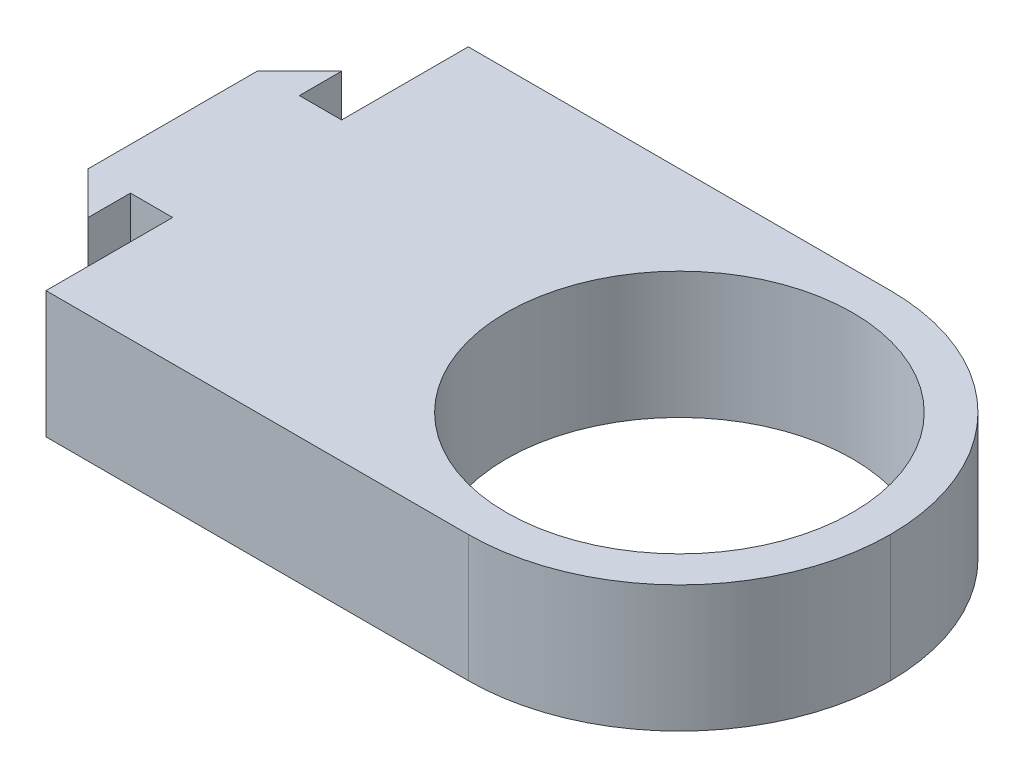
ISO-10303-21;
HEADER;
FILE_DESCRIPTION(('STEP AP214'),'2;1');
FILE_NAME('part.step','',(''),(''),'','','');
FILE_SCHEMA(('AUTOMOTIVE_DESIGN { 1 0 10303 214 1 1 1 1 }'));
ENDSEC;
DATA;
#1=APPLICATION_CONTEXT('core data for automotive mechanical design processes');
#2=APPLICATION_PROTOCOL_DEFINITION('international standard','automotive_design',2000,#1);
#3=PRODUCT_CONTEXT('',#1,'mechanical');
#4=PRODUCT('Part','Part','',(#3));
#5=PRODUCT_RELATED_PRODUCT_CATEGORY('part','',(#4));
#6=PRODUCT_DEFINITION_FORMATION('','',#4);
#7=PRODUCT_DEFINITION_CONTEXT('part definition',#1,'design');
#8=PRODUCT_DEFINITION('design','',#6,#7);
#9=PRODUCT_DEFINITION_SHAPE('','',#8);
#10=(LENGTH_UNIT() NAMED_UNIT(*) SI_UNIT(.MILLI.,.METRE.));
#11=(NAMED_UNIT(*) PLANE_ANGLE_UNIT() SI_UNIT($,.RADIAN.));
#12=(NAMED_UNIT(*) SI_UNIT($,.STERADIAN.) SOLID_ANGLE_UNIT());
#13=UNCERTAINTY_MEASURE_WITH_UNIT(LENGTH_MEASURE(1.E-05),#10,'distance_accuracy_value','');
#14=(GEOMETRIC_REPRESENTATION_CONTEXT(3) GLOBAL_UNCERTAINTY_ASSIGNED_CONTEXT((#13)) GLOBAL_UNIT_ASSIGNED_CONTEXT((#10,
#11,#12)) REPRESENTATION_CONTEXT('',''));
#15=CARTESIAN_POINT('',(0.,0.,0.));
#16=DIRECTION('',(0.,0.,1.));
#17=DIRECTION('',(1.,0.,0.));
#18=AXIS2_PLACEMENT_3D('',#15,#16,#17);
#19=CARTESIAN_POINT('',(-15.,3.,-10.));
#20=DIRECTION('',(1.,0.,0.));
#21=DIRECTION('',(0.,0.,-1.));
#22=AXIS2_PLACEMENT_3D('',#19,#20,#21);
#23=PLANE('',#22);
#24=DIRECTION('',(0.,1.,0.));
#25=VECTOR('',#24,1.);
#26=CARTESIAN_POINT('',(-15.,3.,4.00000000000001));
#27=LINE('',#26,#25);
#28=CARTESIAN_POINT('',(-15.,-3.,4.00000000000001));
#29=VERTEX_POINT('',#28);
#30=CARTESIAN_POINT('',(-15.,3.,4.00000000000001));
#31=VERTEX_POINT('',#30);
#32=EDGE_CURVE('E179',#29,#31,#27,.T.);
#33=ORIENTED_EDGE('',*,*,#32,.F.);
#34=DIRECTION('',(0.,0.,1.));
#35=VECTOR('',#34,1.);
#36=CARTESIAN_POINT('',(-15.,-3.,-10.));
#37=LINE('',#36,#35);
#38=CARTESIAN_POINT('',(-15.,-3.,10.));
#39=VERTEX_POINT('',#38);
#40=EDGE_CURVE('E214',#29,#39,#37,.T.);
#41=ORIENTED_EDGE('',*,*,#40,.T.);
#42=DIRECTION('',(0.,-1.,0.));
#43=VECTOR('',#42,1.);
#44=CARTESIAN_POINT('',(-15.,3.,10.));
#45=LINE('',#44,#43);
#46=CARTESIAN_POINT('',(-15.,3.,10.));
#47=VERTEX_POINT('',#46);
#48=EDGE_CURVE('E212',#47,#39,#45,.T.);
#49=ORIENTED_EDGE('',*,*,#48,.F.);
#50=DIRECTION('',(0.,0.,1.));
#51=VECTOR('',#50,1.);
#52=CARTESIAN_POINT('',(-15.,3.,-10.));
#53=LINE('',#52,#51);
#54=EDGE_CURVE('E204',#31,#47,#53,.T.);
#55=ORIENTED_EDGE('',*,*,#54,.F.);
#56=EDGE_LOOP('',(#33,#41,#49,#55));
#57=FACE_BOUND('',#56,.T.);
#58=ADVANCED_FACE('F44',(#57),#23,.F.);
#59=DIRECTION('',(0.,-1.,0.));
#60=VECTOR('',#59,1.);
#61=CARTESIAN_POINT('',(-15.,3.,-3.99999999999999));
#62=LINE('',#61,#60);
#63=CARTESIAN_POINT('',(-15.,3.,-3.99999999999999));
#64=VERTEX_POINT('',#63);
#65=CARTESIAN_POINT('',(-15.,-3.,-3.99999999999999));
#66=VERTEX_POINT('',#65);
#67=EDGE_CURVE('E175',#64,#66,#62,.T.);
#68=ORIENTED_EDGE('',*,*,#67,.F.);
#69=CARTESIAN_POINT('',(-15.,3.,-10.));
#70=VERTEX_POINT('',#69);
#71=EDGE_CURVE('E206',#70,#64,#53,.T.);
#72=ORIENTED_EDGE('',*,*,#71,.F.);
#73=DIRECTION('',(0.,-1.,0.));
#74=VECTOR('',#73,1.);
#75=CARTESIAN_POINT('',(-15.,3.,-10.));
#76=LINE('',#75,#74);
#77=CARTESIAN_POINT('',(-15.,-3.,-10.));
#78=VERTEX_POINT('',#77);
#79=EDGE_CURVE('E221',#70,#78,#76,.T.);
#80=ORIENTED_EDGE('',*,*,#79,.T.);
#81=EDGE_CURVE('E215',#78,#66,#37,.T.);
#82=ORIENTED_EDGE('',*,*,#81,.T.);
#83=EDGE_LOOP('',(#68,#72,#80,#82));
#84=FACE_BOUND('',#83,.T.);
#85=ADVANCED_FACE('F261',(#84),#23,.F.);
#86=CARTESIAN_POINT('',(-15.,3.,-10.));
#87=DIRECTION('',(0.,0.,1.));
#88=DIRECTION('',(1.,0.,0.));
#89=AXIS2_PLACEMENT_3D('',#86,#87,#88);
#90=PLANE('',#89);
#91=DIRECTION('',(-1.,0.,0.));
#92=VECTOR('',#91,1.);
#93=CARTESIAN_POINT('',(-15.,3.,-10.));
#94=LINE('',#93,#92);
#95=CARTESIAN_POINT('',(4.99999999999999,3.,-10.));
#96=VERTEX_POINT('',#95);
#97=EDGE_CURVE('E202',#96,#70,#94,.T.);
#98=ORIENTED_EDGE('',*,*,#97,.F.);
#99=DIRECTION('',(0.,-1.,0.));
#100=VECTOR('',#99,1.);
#101=CARTESIAN_POINT('',(4.99999999999999,3.,-10.));
#102=LINE('',#101,#100);
#103=CARTESIAN_POINT('',(4.99999999999999,-3.,-10.));
#104=VERTEX_POINT('',#103);
#105=EDGE_CURVE('E224',#96,#104,#102,.T.);
#106=ORIENTED_EDGE('',*,*,#105,.T.);
#107=DIRECTION('',(-1.,0.,0.));
#108=VECTOR('',#107,1.);
#109=CARTESIAN_POINT('',(-15.,-3.,-10.));
#110=LINE('',#109,#108);
#111=EDGE_CURVE('E198',#104,#78,#110,.T.);
#112=ORIENTED_EDGE('',*,*,#111,.T.);
#113=ORIENTED_EDGE('',*,*,#79,.F.);
#114=EDGE_LOOP('',(#98,#106,#112,#113));
#115=FACE_BOUND('',#114,.T.);
#116=ADVANCED_FACE('F267',(#115),#90,.F.);
#117=CARTESIAN_POINT('',(-15.,3.,10.));
#118=DIRECTION('',(0.,0.,-1.));
#119=DIRECTION('',(-1.,0.,0.));
#120=AXIS2_PLACEMENT_3D('',#117,#118,#119);
#121=PLANE('',#120);
#122=DIRECTION('',(1.,0.,0.));
#123=VECTOR('',#122,1.);
#124=CARTESIAN_POINT('',(-15.,-3.,10.));
#125=LINE('',#124,#123);
#126=CARTESIAN_POINT('',(5.,-3.,10.));
#127=VERTEX_POINT('',#126);
#128=EDGE_CURVE('E205',#39,#127,#125,.T.);
#129=ORIENTED_EDGE('',*,*,#128,.T.);
#130=DIRECTION('',(0.,-1.,0.));
#131=VECTOR('',#130,1.);
#132=CARTESIAN_POINT('',(5.,3.,10.));
#133=LINE('',#132,#131);
#134=CARTESIAN_POINT('',(5.,3.,10.));
#135=VERTEX_POINT('',#134);
#136=EDGE_CURVE('E235',#127,#135,#133,.F.);
#137=ORIENTED_EDGE('',*,*,#136,.T.);
#138=DIRECTION('',(1.,0.,0.));
#139=VECTOR('',#138,1.);
#140=CARTESIAN_POINT('',(-15.,3.,10.));
#141=LINE('',#140,#139);
#142=EDGE_CURVE('E209',#47,#135,#141,.T.);
#143=ORIENTED_EDGE('',*,*,#142,.F.);
#144=ORIENTED_EDGE('',*,*,#48,.T.);
#145=EDGE_LOOP('',(#129,#137,#143,#144));
#146=FACE_BOUND('',#145,.T.);
#147=ADVANCED_FACE('F271',(#146),#121,.F.);
#148=CARTESIAN_POINT('',(0.,3.,0.));
#149=DIRECTION('',(0.,1.,0.));
#150=DIRECTION('',(0.,0.,1.));
#151=AXIS2_PLACEMENT_3D('',#148,#149,#150);
#152=PLANE('',#151);
#153=CARTESIAN_POINT('',(5.,3.,0.));
#154=DIRECTION('',(0.,1.,0.));
#155=DIRECTION('',(0.,0.,1.));
#156=AXIS2_PLACEMENT_3D('',#153,#154,#155);
#157=CIRCLE('',#156,8.2);
#158=CARTESIAN_POINT('',(5.,3.,8.2));
#159=VERTEX_POINT('',#158);
#160=EDGE_CURVE('E199',#159,#159,#157,.T.);
#161=ORIENTED_EDGE('',*,*,#160,.F.);
#162=EDGE_LOOP('',(#161));
#163=FACE_BOUND('',#162,.T.);
#164=DIRECTION('',(0.,0.,-1.));
#165=VECTOR('',#164,1.);
#166=CARTESIAN_POINT('',(-19.,3.,-5.99999999999999));
#167=LINE('',#166,#165);
#168=CARTESIAN_POINT('',(-19.,3.,4.));
#169=VERTEX_POINT('',#168);
#170=CARTESIAN_POINT('',(-19.,3.,-3.99999999999999));
#171=VERTEX_POINT('',#170);
#172=EDGE_CURVE('E144',#169,#171,#167,.T.);
#173=ORIENTED_EDGE('',*,*,#172,.F.);
#174=DIRECTION('',(0.707106781186546,0.,0.707106781186549));
#175=VECTOR('',#174,1.);
#176=CARTESIAN_POINT('',(-11.5,3.,11.5));
#177=LINE('',#176,#175);
#178=CARTESIAN_POINT('',(-17.,3.,6.00000000000001));
#179=VERTEX_POINT('',#178);
#180=EDGE_CURVE('E138',#169,#179,#177,.T.);
#181=ORIENTED_EDGE('',*,*,#180,.T.);
#182=DIRECTION('',(0.,0.,-1.));
#183=VECTOR('',#182,1.);
#184=CARTESIAN_POINT('',(-17.,3.,-5.99999999999999));
#185=LINE('',#184,#183);
#186=CARTESIAN_POINT('',(-17.,3.,4.00000000000001));
#187=VERTEX_POINT('',#186);
#188=EDGE_CURVE('E142',#179,#187,#185,.T.);
#189=ORIENTED_EDGE('',*,*,#188,.T.);
#190=DIRECTION('',(1.,0.,0.));
#191=VECTOR('',#190,1.);
#192=CARTESIAN_POINT('',(-17.,3.,4.00000000000001));
#193=LINE('',#192,#191);
#194=EDGE_CURVE('E192',#187,#31,#193,.T.);
#195=ORIENTED_EDGE('',*,*,#194,.T.);
#196=ORIENTED_EDGE('',*,*,#54,.T.);
#197=ORIENTED_EDGE('',*,*,#142,.T.);
#198=CARTESIAN_POINT('',(5.,3.,0.));
#199=DIRECTION('',(0.,1.,0.));
#200=DIRECTION('',(0.,0.,1.));
#201=AXIS2_PLACEMENT_3D('',#198,#199,#200);
#202=CIRCLE('',#201,10.);
#203=CARTESIAN_POINT('',(15.,3.,0.));
#204=VERTEX_POINT('',#203);
#205=EDGE_CURVE('E231',#135,#204,#202,.T.);
#206=ORIENTED_EDGE('',*,*,#205,.T.);
#207=CARTESIAN_POINT('',(4.99999999999999,3.,0.));
#208=DIRECTION('',(0.,1.,0.));
#209=DIRECTION('',(0.,0.,1.));
#210=AXIS2_PLACEMENT_3D('',#207,#208,#209);
#211=CIRCLE('',#210,10.);
#212=EDGE_CURVE('E233',#204,#96,#211,.T.);
#213=ORIENTED_EDGE('',*,*,#212,.T.);
#214=ORIENTED_EDGE('',*,*,#97,.T.);
#215=ORIENTED_EDGE('',*,*,#71,.T.);
#216=DIRECTION('',(1.,0.,0.));
#217=VECTOR('',#216,1.);
#218=CARTESIAN_POINT('',(-17.,3.,-3.99999999999999));
#219=LINE('',#218,#217);
#220=CARTESIAN_POINT('',(-17.,3.,-3.99999999999999));
#221=VERTEX_POINT('',#220);
#222=EDGE_CURVE('E189',#221,#64,#219,.T.);
#223=ORIENTED_EDGE('',*,*,#222,.F.);
#224=CARTESIAN_POINT('',(-17.,3.,-5.99999999999999));
#225=VERTEX_POINT('',#224);
#226=EDGE_CURVE('E160',#221,#225,#185,.T.);
#227=ORIENTED_EDGE('',*,*,#226,.T.);
#228=DIRECTION('',(-0.707106781186549,0.,0.707106781186546));
#229=VECTOR('',#228,1.);
#230=CARTESIAN_POINT('',(-11.5,3.,-11.5));
#231=LINE('',#230,#229);
#232=EDGE_CURVE('E149',#225,#171,#231,.T.);
#233=ORIENTED_EDGE('',*,*,#232,.T.);
#234=EDGE_LOOP('',(#173,#181,#189,#195,#196,#197,#206,#213,#214,#215,#223,#227,#233));
#235=FACE_BOUND('',#234,.T.);
#236=ADVANCED_FACE('F140',(#163,#235),#152,.T.);
#237=CARTESIAN_POINT('',(0.,-3.,0.));
#238=DIRECTION('',(0.,1.,0.));
#239=DIRECTION('',(0.,0.,1.));
#240=AXIS2_PLACEMENT_3D('',#237,#238,#239);
#241=PLANE('',#240);
#242=CARTESIAN_POINT('',(5.,-3.,0.));
#243=DIRECTION('',(0.,1.,0.));
#244=DIRECTION('',(0.,0.,1.));
#245=AXIS2_PLACEMENT_3D('',#242,#243,#244);
#246=CIRCLE('',#245,8.2);
#247=CARTESIAN_POINT('',(5.,-3.,8.2));
#248=VERTEX_POINT('',#247);
#249=EDGE_CURVE('E195',#248,#248,#246,.T.);
#250=ORIENTED_EDGE('',*,*,#249,.T.);
#251=EDGE_LOOP('',(#250));
#252=FACE_BOUND('',#251,.T.);
#253=DIRECTION('',(0.,0.,1.));
#254=VECTOR('',#253,1.);
#255=CARTESIAN_POINT('',(-17.,-3.,-5.99999999999999));
#256=LINE('',#255,#254);
#257=CARTESIAN_POINT('',(-17.,-3.,4.00000000000001));
#258=VERTEX_POINT('',#257);
#259=CARTESIAN_POINT('',(-17.,-3.,6.00000000000001));
#260=VERTEX_POINT('',#259);
#261=EDGE_CURVE('E169',#258,#260,#256,.T.);
#262=ORIENTED_EDGE('',*,*,#261,.T.);
#263=DIRECTION('',(-0.707106781186546,0.,-0.707106781186549));
#264=VECTOR('',#263,1.);
#265=CARTESIAN_POINT('',(-19.,-3.,4.));
#266=LINE('',#265,#264);
#267=CARTESIAN_POINT('',(-19.,-3.,4.));
#268=VERTEX_POINT('',#267);
#269=EDGE_CURVE('E13',#260,#268,#266,.T.);
#270=ORIENTED_EDGE('',*,*,#269,.T.);
#271=DIRECTION('',(0.,0.,1.));
#272=VECTOR('',#271,1.);
#273=CARTESIAN_POINT('',(-19.,-3.,-5.99999999999999));
#274=LINE('',#273,#272);
#275=CARTESIAN_POINT('',(-19.,-3.,-3.99999999999998));
#276=VERTEX_POINT('',#275);
#277=EDGE_CURVE('E165',#276,#268,#274,.T.);
#278=ORIENTED_EDGE('',*,*,#277,.F.);
#279=DIRECTION('',(0.707106781186549,0.,-0.707106781186546));
#280=VECTOR('',#279,1.);
#281=CARTESIAN_POINT('',(-19.,-3.,-3.99999999999998));
#282=LINE('',#281,#280);
#283=CARTESIAN_POINT('',(-17.,-3.,-5.99999999999999));
#284=VERTEX_POINT('',#283);
#285=EDGE_CURVE('E52',#276,#284,#282,.T.);
#286=ORIENTED_EDGE('',*,*,#285,.T.);
#287=CARTESIAN_POINT('',(-17.,-3.,-3.99999999999999));
#288=VERTEX_POINT('',#287);
#289=EDGE_CURVE('E170',#284,#288,#256,.T.);
#290=ORIENTED_EDGE('',*,*,#289,.T.);
#291=DIRECTION('',(1.,0.,0.));
#292=VECTOR('',#291,1.);
#293=CARTESIAN_POINT('',(-17.,-3.,-3.99999999999999));
#294=LINE('',#293,#292);
#295=EDGE_CURVE('E186',#288,#66,#294,.T.);
#296=ORIENTED_EDGE('',*,*,#295,.T.);
#297=ORIENTED_EDGE('',*,*,#81,.F.);
#298=ORIENTED_EDGE('',*,*,#111,.F.);
#299=CARTESIAN_POINT('',(4.99999999999999,-3.,0.));
#300=DIRECTION('',(0.,1.,0.));
#301=DIRECTION('',(0.,0.,1.));
#302=AXIS2_PLACEMENT_3D('',#299,#300,#301);
#303=CIRCLE('',#302,10.);
#304=CARTESIAN_POINT('',(15.,-3.,0.));
#305=VERTEX_POINT('',#304);
#306=EDGE_CURVE('E229',#104,#305,#303,.F.);
#307=ORIENTED_EDGE('',*,*,#306,.T.);
#308=CARTESIAN_POINT('',(5.,-3.,0.));
#309=DIRECTION('',(0.,1.,0.));
#310=DIRECTION('',(0.,0.,1.));
#311=AXIS2_PLACEMENT_3D('',#308,#309,#310);
#312=CIRCLE('',#311,10.);
#313=EDGE_CURVE('E227',#305,#127,#312,.F.);
#314=ORIENTED_EDGE('',*,*,#313,.T.);
#315=ORIENTED_EDGE('',*,*,#128,.F.);
#316=ORIENTED_EDGE('',*,*,#40,.F.);
#317=DIRECTION('',(1.,0.,0.));
#318=VECTOR('',#317,1.);
#319=CARTESIAN_POINT('',(-17.,-3.,4.00000000000001));
#320=LINE('',#319,#318);
#321=EDGE_CURVE('E178',#258,#29,#320,.T.);
#322=ORIENTED_EDGE('',*,*,#321,.F.);
#323=EDGE_LOOP('',(#262,#270,#278,#286,#290,#296,#297,#298,#307,#314,#315,#316,#322));
#324=FACE_BOUND('',#323,.T.);
#325=ADVANCED_FACE('F244',(#252,#324),#241,.F.);
#326=CARTESIAN_POINT('',(5.,-3.,0.));
#327=DIRECTION('',(0.,1.,0.));
#328=DIRECTION('',(0.,0.,1.));
#329=AXIS2_PLACEMENT_3D('',#326,#327,#328);
#330=CYLINDRICAL_SURFACE('',#329,8.2);
#331=ORIENTED_EDGE('',*,*,#249,.F.);
#332=EDGE_LOOP('',(#331));
#333=FACE_BOUND('',#332,.T.);
#334=ORIENTED_EDGE('',*,*,#160,.T.);
#335=EDGE_LOOP('',(#334));
#336=FACE_BOUND('',#335,.T.);
#337=ADVANCED_FACE('F283',(#333,#336),#330,.F.);
#338=CARTESIAN_POINT('',(5.,3.,0.));
#339=DIRECTION('',(0.,-1.,0.));
#340=DIRECTION('',(0.,0.,-1.));
#341=AXIS2_PLACEMENT_3D('',#338,#339,#340);
#342=CYLINDRICAL_SURFACE('',#341,10.);
#343=DIRECTION('',(0.,-1.,0.));
#344=VECTOR('',#343,1.);
#345=CARTESIAN_POINT('',(15.,3.,0.));
#346=LINE('',#345,#344);
#347=EDGE_CURVE('E194',#204,#305,#346,.T.);
#348=ORIENTED_EDGE('',*,*,#347,.F.);
#349=ORIENTED_EDGE('',*,*,#205,.F.);
#350=ORIENTED_EDGE('',*,*,#136,.F.);
#351=ORIENTED_EDGE('',*,*,#313,.F.);
#352=EDGE_LOOP('',(#348,#349,#350,#351));
#353=FACE_BOUND('',#352,.T.);
#354=ADVANCED_FACE('F280',(#353),#342,.T.);
#355=CARTESIAN_POINT('',(4.99999999999999,3.,0.));
#356=DIRECTION('',(0.,-1.,0.));
#357=DIRECTION('',(0.,0.,-1.));
#358=AXIS2_PLACEMENT_3D('',#355,#356,#357);
#359=CYLINDRICAL_SURFACE('',#358,10.);
#360=ORIENTED_EDGE('',*,*,#212,.F.);
#361=ORIENTED_EDGE('',*,*,#347,.T.);
#362=ORIENTED_EDGE('',*,*,#306,.F.);
#363=ORIENTED_EDGE('',*,*,#105,.F.);
#364=EDGE_LOOP('',(#360,#361,#362,#363));
#365=FACE_BOUND('',#364,.T.);
#366=ADVANCED_FACE('F276',(#365),#359,.T.);
#367=CARTESIAN_POINT('',(-17.,3.,4.00000000000001));
#368=DIRECTION('',(0.,0.,-1.));
#369=DIRECTION('',(-1.,0.,0.));
#370=AXIS2_PLACEMENT_3D('',#367,#368,#369);
#371=PLANE('',#370);
#372=ORIENTED_EDGE('',*,*,#32,.T.);
#373=ORIENTED_EDGE('',*,*,#194,.F.);
#374=DIRECTION('',(0.,1.,0.));
#375=VECTOR('',#374,1.);
#376=CARTESIAN_POINT('',(-17.,3.,4.00000000000001));
#377=LINE('',#376,#375);
#378=EDGE_CURVE('E158',#258,#187,#377,.T.);
#379=ORIENTED_EDGE('',*,*,#378,.F.);
#380=ORIENTED_EDGE('',*,*,#321,.T.);
#381=EDGE_LOOP('',(#372,#373,#379,#380));
#382=FACE_BOUND('',#381,.T.);
#383=ADVANCED_FACE('F279',(#382),#371,.F.);
#384=CARTESIAN_POINT('',(-17.,3.,-3.99999999999999));
#385=DIRECTION('',(0.,0.,1.));
#386=DIRECTION('',(1.,0.,0.));
#387=AXIS2_PLACEMENT_3D('',#384,#385,#386);
#388=PLANE('',#387);
#389=ORIENTED_EDGE('',*,*,#67,.T.);
#390=ORIENTED_EDGE('',*,*,#295,.F.);
#391=DIRECTION('',(0.,-1.,0.));
#392=VECTOR('',#391,1.);
#393=CARTESIAN_POINT('',(-17.,3.,-3.99999999999999));
#394=LINE('',#393,#392);
#395=EDGE_CURVE('E174',#221,#288,#394,.T.);
#396=ORIENTED_EDGE('',*,*,#395,.F.);
#397=ORIENTED_EDGE('',*,*,#222,.T.);
#398=EDGE_LOOP('',(#389,#390,#396,#397));
#399=FACE_BOUND('',#398,.T.);
#400=ADVANCED_FACE('F302',(#399),#388,.F.);
#401=CARTESIAN_POINT('',(-17.,0.,0.));
#402=DIRECTION('',(-1.,0.,0.));
#403=DIRECTION('',(0.,0.,1.));
#404=AXIS2_PLACEMENT_3D('',#401,#402,#403);
#405=PLANE('',#404);
#406=ORIENTED_EDGE('',*,*,#261,.F.);
#407=ORIENTED_EDGE('',*,*,#378,.T.);
#408=ORIENTED_EDGE('',*,*,#188,.F.);
#409=DIRECTION('',(0.,1.,0.));
#410=VECTOR('',#409,1.);
#411=CARTESIAN_POINT('',(-17.,3.,6.00000000000001));
#412=LINE('',#411,#410);
#413=EDGE_CURVE('E156',#260,#179,#412,.T.);
#414=ORIENTED_EDGE('',*,*,#413,.F.);
#415=EDGE_LOOP('',(#406,#407,#408,#414));
#416=FACE_BOUND('',#415,.T.);
#417=ADVANCED_FACE('F155',(#416),#405,.F.);
#418=ORIENTED_EDGE('',*,*,#226,.F.);
#419=ORIENTED_EDGE('',*,*,#395,.T.);
#420=ORIENTED_EDGE('',*,*,#289,.F.);
#421=DIRECTION('',(0.,-1.,0.));
#422=VECTOR('',#421,1.);
#423=CARTESIAN_POINT('',(-17.,3.,-5.99999999999999));
#424=LINE('',#423,#422);
#425=EDGE_CURVE('E159',#225,#284,#424,.T.);
#426=ORIENTED_EDGE('',*,*,#425,.F.);
#427=EDGE_LOOP('',(#418,#419,#420,#426));
#428=FACE_BOUND('',#427,.T.);
#429=ADVANCED_FACE('F248',(#428),#405,.F.);
#430=CARTESIAN_POINT('',(-19.,0.,0.));
#431=DIRECTION('',(-1.,0.,0.));
#432=DIRECTION('',(0.,0.,1.));
#433=AXIS2_PLACEMENT_3D('',#430,#431,#432);
#434=PLANE('',#433);
#435=ORIENTED_EDGE('',*,*,#277,.T.);
#436=DIRECTION('',(0.,1.,0.));
#437=VECTOR('',#436,1.);
#438=CARTESIAN_POINT('',(-19.,3.,4.));
#439=LINE('',#438,#437);
#440=EDGE_CURVE('E241',#268,#169,#439,.T.);
#441=ORIENTED_EDGE('',*,*,#440,.T.);
#442=ORIENTED_EDGE('',*,*,#172,.T.);
#443=DIRECTION('',(0.,-1.,0.));
#444=VECTOR('',#443,1.);
#445=CARTESIAN_POINT('',(-19.,-3.,-3.99999999999998));
#446=LINE('',#445,#444);
#447=EDGE_CURVE('E237',#171,#276,#446,.T.);
#448=ORIENTED_EDGE('',*,*,#447,.T.);
#449=EDGE_LOOP('',(#435,#441,#442,#448));
#450=FACE_BOUND('',#449,.T.);
#451=ADVANCED_FACE('F252',(#450),#434,.T.);
#452=CARTESIAN_POINT('',(-19.,0.,4.));
#453=DIRECTION('',(-0.707106781186549,0.,0.707106781186546));
#454=DIRECTION('',(0.,-1.,0.));
#455=AXIS2_PLACEMENT_3D('',#452,#453,#454);
#456=PLANE('',#455);
#457=ORIENTED_EDGE('',*,*,#269,.F.);
#458=ORIENTED_EDGE('',*,*,#413,.T.);
#459=ORIENTED_EDGE('',*,*,#180,.F.);
#460=ORIENTED_EDGE('',*,*,#440,.F.);
#461=EDGE_LOOP('',(#457,#458,#459,#460));
#462=FACE_BOUND('',#461,.T.);
#463=ADVANCED_FACE('F162',(#462),#456,.T.);
#464=CARTESIAN_POINT('',(-19.,0.,-3.99999999999998));
#465=DIRECTION('',(-0.707106781186546,0.,-0.707106781186549));
#466=DIRECTION('',(0.,1.,0.));
#467=AXIS2_PLACEMENT_3D('',#464,#465,#466);
#468=PLANE('',#467);
#469=ORIENTED_EDGE('',*,*,#232,.F.);
#470=ORIENTED_EDGE('',*,*,#425,.T.);
#471=ORIENTED_EDGE('',*,*,#285,.F.);
#472=ORIENTED_EDGE('',*,*,#447,.F.);
#473=EDGE_LOOP('',(#469,#470,#471,#472));
#474=FACE_BOUND('',#473,.T.);
#475=ADVANCED_FACE('F46',(#474),#468,.T.);
#476=CLOSED_SHELL('',(#58,#85,#116,#147,#236,#325,#337,#354,#366,#383,#400,#417,#429,#451,#463,#475));
#477=MANIFOLD_SOLID_BREP('B2',#476);
#478=ADVANCED_BREP_SHAPE_REPRESENTATION('',(#18,#477),#14);
#479=SHAPE_DEFINITION_REPRESENTATION(#9,#478);
ENDSEC;
END-ISO-10303-21;
